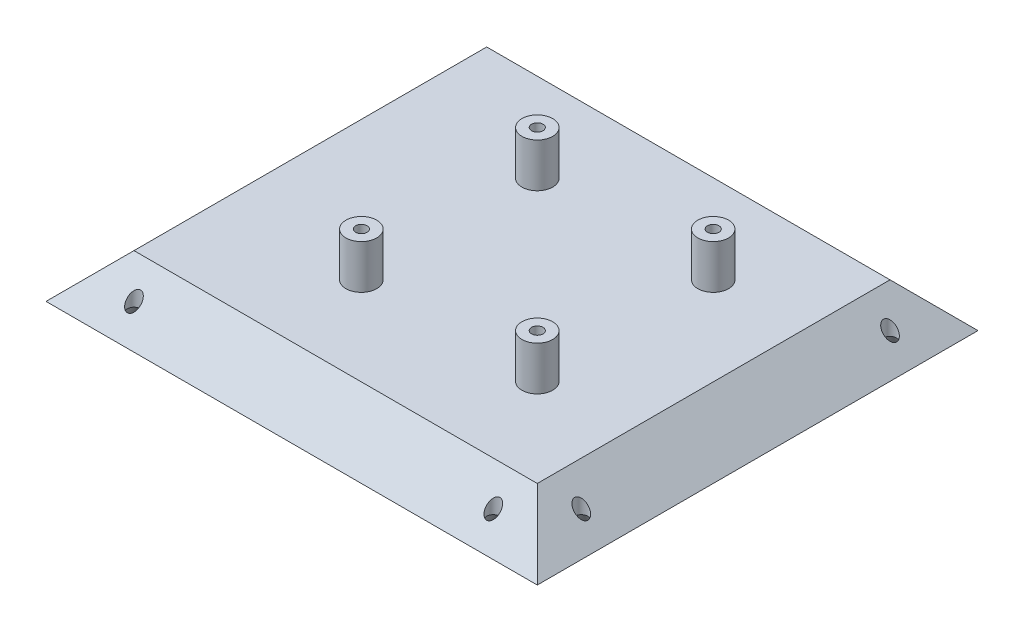
ISO-10303-21;
HEADER;
FILE_DESCRIPTION(('STEP AP214'),'2;1');
FILE_NAME('part.step','',(''),(''),'','','');
FILE_SCHEMA(('AUTOMOTIVE_DESIGN { 1 0 10303 214 1 1 1 1 }'));
ENDSEC;
DATA;
#1=APPLICATION_CONTEXT('core data for automotive mechanical design processes');
#2=APPLICATION_PROTOCOL_DEFINITION('international standard','automotive_design',2000,#1);
#3=PRODUCT_CONTEXT('',#1,'mechanical');
#4=PRODUCT('Part','Part','',(#3));
#5=PRODUCT_RELATED_PRODUCT_CATEGORY('part','',(#4));
#6=PRODUCT_DEFINITION_FORMATION('','',#4);
#7=PRODUCT_DEFINITION_CONTEXT('part definition',#1,'design');
#8=PRODUCT_DEFINITION('design','',#6,#7);
#9=PRODUCT_DEFINITION_SHAPE('','',#8);
#10=(LENGTH_UNIT() NAMED_UNIT(*) SI_UNIT(.MILLI.,.METRE.));
#11=(NAMED_UNIT(*) PLANE_ANGLE_UNIT() SI_UNIT($,.RADIAN.));
#12=(NAMED_UNIT(*) SI_UNIT($,.STERADIAN.) SOLID_ANGLE_UNIT());
#13=UNCERTAINTY_MEASURE_WITH_UNIT(LENGTH_MEASURE(1.E-05),#10,'distance_accuracy_value','');
#14=(GEOMETRIC_REPRESENTATION_CONTEXT(3) GLOBAL_UNCERTAINTY_ASSIGNED_CONTEXT((#13)) GLOBAL_UNIT_ASSIGNED_CONTEXT((#10,
#11,#12)) REPRESENTATION_CONTEXT('',''));
#15=CARTESIAN_POINT('',(0.,0.,0.));
#16=DIRECTION('',(0.,0.,1.));
#17=DIRECTION('',(1.,0.,0.));
#18=AXIS2_PLACEMENT_3D('',#15,#16,#17);
#19=CARTESIAN_POINT('',(0.,10.,0.));
#20=DIRECTION('',(0.,1.,0.));
#21=DIRECTION('',(0.,0.,1.));
#22=AXIS2_PLACEMENT_3D('',#19,#20,#21);
#23=PLANE('',#22);
#24=CARTESIAN_POINT('',(41.6,10.,30.1));
#25=DIRECTION('',(0.,1.,0.));
#26=DIRECTION('',(0.,0.,1.));
#27=AXIS2_PLACEMENT_3D('',#24,#25,#26);
#28=CIRCLE('',#27,3.5);
#29=CARTESIAN_POINT('',(41.6,10.,33.6));
#30=VERTEX_POINT('',#29);
#31=EDGE_CURVE('E367',#30,#30,#28,.T.);
#32=ORIENTED_EDGE('',*,*,#31,.F.);
#33=EDGE_LOOP('',(#32));
#34=FACE_BOUND('',#33,.T.);
#35=CARTESIAN_POINT('',(41.6,10.,70.1));
#36=DIRECTION('',(0.,1.,0.));
#37=DIRECTION('',(0.,0.,-1.));
#38=AXIS2_PLACEMENT_3D('',#35,#36,#37);
#39=CIRCLE('',#38,3.5);
#40=CARTESIAN_POINT('',(41.6,10.,66.6));
#41=VERTEX_POINT('',#40);
#42=EDGE_CURVE('E376',#41,#41,#39,.T.);
#43=ORIENTED_EDGE('',*,*,#42,.F.);
#44=EDGE_LOOP('',(#43));
#45=FACE_BOUND('',#44,.T.);
#46=CARTESIAN_POINT('',(81.6,10.,30.1));
#47=DIRECTION('',(0.,1.,0.));
#48=DIRECTION('',(0.,0.,-1.));
#49=AXIS2_PLACEMENT_3D('',#46,#47,#48);
#50=CIRCLE('',#49,3.50000000000001);
#51=CARTESIAN_POINT('',(81.6,10.,26.6));
#52=VERTEX_POINT('',#51);
#53=EDGE_CURVE('E385',#52,#52,#50,.T.);
#54=ORIENTED_EDGE('',*,*,#53,.F.);
#55=EDGE_LOOP('',(#54));
#56=FACE_BOUND('',#55,.T.);
#57=CARTESIAN_POINT('',(81.6,10.,70.1));
#58=DIRECTION('',(0.,1.,0.));
#59=DIRECTION('',(0.,0.,1.));
#60=AXIS2_PLACEMENT_3D('',#57,#58,#59);
#61=CIRCLE('',#60,3.50000000000001);
#62=CARTESIAN_POINT('',(81.6,10.,73.6));
#63=VERTEX_POINT('',#62);
#64=EDGE_CURVE('E394',#63,#63,#61,.T.);
#65=ORIENTED_EDGE('',*,*,#64,.F.);
#66=EDGE_LOOP('',(#65));
#67=FACE_BOUND('',#66,.T.);
#68=DIRECTION('',(-1.,0.,0.));
#69=VECTOR('',#68,1.);
#70=CARTESIAN_POINT('',(101.7,10.,10.));
#71=LINE('',#70,#69);
#72=CARTESIAN_POINT('',(101.7,10.,10.));
#73=VERTEX_POINT('',#72);
#74=CARTESIAN_POINT('',(9.99999999999999,10.,10.));
#75=VERTEX_POINT('',#74);
#76=EDGE_CURVE('E121',#73,#75,#71,.T.);
#77=ORIENTED_EDGE('',*,*,#76,.T.);
#78=DIRECTION('',(0.,0.,1.));
#79=VECTOR('',#78,1.);
#80=CARTESIAN_POINT('',(10.,10.,10.));
#81=LINE('',#80,#79);
#82=CARTESIAN_POINT('',(10.,10.,90.2));
#83=VERTEX_POINT('',#82);
#84=EDGE_CURVE('E118',#75,#83,#81,.T.);
#85=ORIENTED_EDGE('',*,*,#84,.T.);
#86=DIRECTION('',(1.,0.,0.));
#87=VECTOR('',#86,1.);
#88=CARTESIAN_POINT('',(10.,10.,90.2));
#89=LINE('',#88,#87);
#90=CARTESIAN_POINT('',(101.7,10.,90.2));
#91=VERTEX_POINT('',#90);
#92=EDGE_CURVE('E509',#83,#91,#89,.T.);
#93=ORIENTED_EDGE('',*,*,#92,.T.);
#94=DIRECTION('',(0.,0.,-1.));
#95=VECTOR('',#94,1.);
#96=CARTESIAN_POINT('',(101.7,10.,90.2));
#97=LINE('',#96,#95);
#98=EDGE_CURVE('E80',#91,#73,#97,.T.);
#99=ORIENTED_EDGE('',*,*,#98,.T.);
#100=EDGE_LOOP('',(#77,#85,#93,#99));
#101=FACE_BOUND('',#100,.T.);
#102=ADVANCED_FACE('F61',(#34,#45,#56,#67,#101),#23,.T.);
#103=CARTESIAN_POINT('',(0.,0.,0.));
#104=DIRECTION('',(0.,1.,0.));
#105=DIRECTION('',(0.,0.,1.));
#106=AXIS2_PLACEMENT_3D('',#103,#104,#105);
#107=PLANE('',#106);
#108=CARTESIAN_POINT('',(15.,0.,4.99999999999999));
#109=DIRECTION('',(0.,1.,0.));
#110=DIRECTION('',(1.,0.,0.));
#111=AXIS2_PLACEMENT_3D('',#108,#109,#110);
#112=CIRCLE('',#111,3.3);
#113=CARTESIAN_POINT('',(18.3,0.,4.99999999999999));
#114=VERTEX_POINT('',#113);
#115=EDGE_CURVE('E737',#114,#114,#112,.T.);
#116=ORIENTED_EDGE('',*,*,#115,.T.);
#117=EDGE_LOOP('',(#116));
#118=FACE_BOUND('',#117,.T.);
#119=CARTESIAN_POINT('',(4.99999999999999,0.,15.));
#120=DIRECTION('',(0.,-1.,0.));
#121=DIRECTION('',(0.,0.,1.));
#122=AXIS2_PLACEMENT_3D('',#119,#120,#121);
#123=CIRCLE('',#122,3.3);
#124=CARTESIAN_POINT('',(4.99999999999999,0.,18.3));
#125=VERTEX_POINT('',#124);
#126=EDGE_CURVE('E708',#125,#125,#123,.T.);
#127=ORIENTED_EDGE('',*,*,#126,.F.);
#128=EDGE_LOOP('',(#127));
#129=FACE_BOUND('',#128,.T.);
#130=CARTESIAN_POINT('',(15.0000000000001,0.,95.2));
#131=DIRECTION('',(0.,-1.,0.));
#132=DIRECTION('',(1.,0.,0.));
#133=AXIS2_PLACEMENT_3D('',#130,#131,#132);
#134=CIRCLE('',#133,3.3);
#135=CARTESIAN_POINT('',(18.3000000000001,0.,95.2));
#136=VERTEX_POINT('',#135);
#137=EDGE_CURVE('E670',#136,#136,#134,.T.);
#138=ORIENTED_EDGE('',*,*,#137,.F.);
#139=EDGE_LOOP('',(#138));
#140=FACE_BOUND('',#139,.T.);
#141=CARTESIAN_POINT('',(5.00000000000002,0.,85.2));
#142=DIRECTION('',(0.,1.,0.));
#143=DIRECTION('',(0.,0.,-1.));
#144=AXIS2_PLACEMENT_3D('',#141,#142,#143);
#145=CIRCLE('',#144,3.3);
#146=CARTESIAN_POINT('',(5.00000000000002,0.,81.9));
#147=VERTEX_POINT('',#146);
#148=EDGE_CURVE('E591',#147,#147,#145,.T.);
#149=ORIENTED_EDGE('',*,*,#148,.T.);
#150=EDGE_LOOP('',(#149));
#151=FACE_BOUND('',#150,.T.);
#152=CARTESIAN_POINT('',(96.7,0.,4.99999999999999));
#153=DIRECTION('',(0.,-1.,0.));
#154=DIRECTION('',(-1.,0.,0.));
#155=AXIS2_PLACEMENT_3D('',#152,#153,#154);
#156=CIRCLE('',#155,3.3);
#157=CARTESIAN_POINT('',(93.4,0.,4.99999999999999));
#158=VERTEX_POINT('',#157);
#159=EDGE_CURVE('E279',#158,#158,#156,.T.);
#160=ORIENTED_EDGE('',*,*,#159,.F.);
#161=EDGE_LOOP('',(#160));
#162=FACE_BOUND('',#161,.T.);
#163=CARTESIAN_POINT('',(106.7,0.,15.));
#164=DIRECTION('',(0.,1.,0.));
#165=DIRECTION('',(0.,0.,1.));
#166=AXIS2_PLACEMENT_3D('',#163,#164,#165);
#167=CIRCLE('',#166,3.3);
#168=CARTESIAN_POINT('',(106.7,0.,18.3));
#169=VERTEX_POINT('',#168);
#170=EDGE_CURVE('E268',#169,#169,#167,.T.);
#171=ORIENTED_EDGE('',*,*,#170,.T.);
#172=EDGE_LOOP('',(#171));
#173=FACE_BOUND('',#172,.T.);
#174=CARTESIAN_POINT('',(96.7,0.,95.2));
#175=DIRECTION('',(0.,1.,0.));
#176=DIRECTION('',(-1.,0.,0.));
#177=AXIS2_PLACEMENT_3D('',#174,#175,#176);
#178=CIRCLE('',#177,3.3);
#179=CARTESIAN_POINT('',(93.4,0.,95.2));
#180=VERTEX_POINT('',#179);
#181=EDGE_CURVE('E276',#180,#180,#178,.T.);
#182=ORIENTED_EDGE('',*,*,#181,.T.);
#183=EDGE_LOOP('',(#182));
#184=FACE_BOUND('',#183,.T.);
#185=CARTESIAN_POINT('',(106.7,0.,85.2));
#186=DIRECTION('',(0.,-1.,0.));
#187=DIRECTION('',(0.,0.,-1.));
#188=AXIS2_PLACEMENT_3D('',#185,#186,#187);
#189=CIRCLE('',#188,3.3);
#190=CARTESIAN_POINT('',(106.7,0.,81.9));
#191=VERTEX_POINT('',#190);
#192=EDGE_CURVE('E330',#191,#191,#189,.T.);
#193=ORIENTED_EDGE('',*,*,#192,.F.);
#194=EDGE_LOOP('',(#193));
#195=FACE_BOUND('',#194,.T.);
#196=DIRECTION('',(0.,0.,1.));
#197=VECTOR('',#196,1.);
#198=CARTESIAN_POINT('',(0.,0.,0.));
#199=LINE('',#198,#197);
#200=CARTESIAN_POINT('',(0.,0.,0.));
#201=VERTEX_POINT('',#200);
#202=CARTESIAN_POINT('',(0.,0.,100.2));
#203=VERTEX_POINT('',#202);
#204=EDGE_CURVE('E114',#201,#203,#199,.T.);
#205=ORIENTED_EDGE('',*,*,#204,.F.);
#206=DIRECTION('',(-1.,0.,0.));
#207=VECTOR('',#206,1.);
#208=CARTESIAN_POINT('',(0.,0.,0.));
#209=LINE('',#208,#207);
#210=CARTESIAN_POINT('',(111.7,0.,0.));
#211=VERTEX_POINT('',#210);
#212=EDGE_CURVE('E125',#211,#201,#209,.T.);
#213=ORIENTED_EDGE('',*,*,#212,.F.);
#214=DIRECTION('',(0.,0.,-1.));
#215=VECTOR('',#214,1.);
#216=CARTESIAN_POINT('',(111.7,0.,0.));
#217=LINE('',#216,#215);
#218=CARTESIAN_POINT('',(111.7,0.,100.2));
#219=VERTEX_POINT('',#218);
#220=EDGE_CURVE('E132',#219,#211,#217,.T.);
#221=ORIENTED_EDGE('',*,*,#220,.F.);
#222=DIRECTION('',(1.,0.,0.));
#223=VECTOR('',#222,1.);
#224=CARTESIAN_POINT('',(0.,0.,100.2));
#225=LINE('',#224,#223);
#226=EDGE_CURVE('E138',#203,#219,#225,.T.);
#227=ORIENTED_EDGE('',*,*,#226,.F.);
#228=EDGE_LOOP('',(#205,#213,#221,#227));
#229=FACE_BOUND('',#228,.T.);
#230=ADVANCED_FACE('F137',(#118,#129,#140,#151,#162,#173,#184,#195,#229),#107,.F.);
#231=CARTESIAN_POINT('',(0.,50.1,50.1));
#232=DIRECTION('',(0.,-0.707106781186547,-0.707106781186548));
#233=DIRECTION('',(0.,0.707106781186548,-0.707106781186547));
#234=AXIS2_PLACEMENT_3D('',#231,#232,#233);
#235=PLANE('',#234);
#236=CARTESIAN_POINT('',(15.,5.,95.2));
#237=DIRECTION('',(0.,-0.707106781186547,-0.707106781186548));
#238=DIRECTION('',(0.,-0.707106781186548,0.707106781186547));
#239=AXIS2_PLACEMENT_3D('',#236,#237,#238);
#240=ELLIPSE('',#239,2.12132034355964,1.5);
#241=CARTESIAN_POINT('',(15.,3.5,96.7));
#242=VERTEX_POINT('',#241);
#243=EDGE_CURVE('E140',#242,#242,#240,.T.);
#244=ORIENTED_EDGE('',*,*,#243,.T.);
#245=EDGE_LOOP('',(#244));
#246=FACE_BOUND('',#245,.T.);
#247=CARTESIAN_POINT('',(96.7,5.,95.2));
#248=DIRECTION('',(0.,-0.707106781186547,-0.707106781186548));
#249=DIRECTION('',(0.,-0.707106781186548,0.707106781186547));
#250=AXIS2_PLACEMENT_3D('',#247,#248,#249);
#251=ELLIPSE('',#250,2.12132034355964,1.5);
#252=CARTESIAN_POINT('',(96.7,3.5,96.7));
#253=VERTEX_POINT('',#252);
#254=EDGE_CURVE('E440',#253,#253,#251,.T.);
#255=ORIENTED_EDGE('',*,*,#254,.T.);
#256=EDGE_LOOP('',(#255));
#257=FACE_BOUND('',#256,.T.);
#258=DIRECTION('',(-0.577350269189626,0.577350269189626,-0.577350269189626));
#259=VECTOR('',#258,1.);
#260=CARTESIAN_POINT('',(111.7,0.,100.2));
#261=LINE('',#260,#259);
#262=EDGE_CURVE('E89',#219,#91,#261,.T.);
#263=ORIENTED_EDGE('',*,*,#262,.T.);
#264=ORIENTED_EDGE('',*,*,#92,.F.);
#265=DIRECTION('',(0.577350269189626,0.577350269189626,-0.577350269189626));
#266=VECTOR('',#265,1.);
#267=CARTESIAN_POINT('',(0.,0.,100.2));
#268=LINE('',#267,#266);
#269=EDGE_CURVE('E475',#203,#83,#268,.T.);
#270=ORIENTED_EDGE('',*,*,#269,.F.);
#271=ORIENTED_EDGE('',*,*,#226,.T.);
#272=EDGE_LOOP('',(#263,#264,#270,#271));
#273=FACE_BOUND('',#272,.T.);
#274=ADVANCED_FACE('F160',(#246,#257,#273),#235,.F.);
#275=CARTESIAN_POINT('',(0.,0.,0.));
#276=DIRECTION('',(0.707106781186548,-0.707106781186547,0.));
#277=DIRECTION('',(0.707106781186547,0.707106781186548,0.));
#278=AXIS2_PLACEMENT_3D('',#275,#276,#277);
#279=PLANE('',#278);
#280=CARTESIAN_POINT('',(5.,4.99999999999999,85.2));
#281=DIRECTION('',(0.707106781186548,-0.707106781186547,0.));
#282=DIRECTION('',(-0.707106781186547,-0.707106781186548,0.));
#283=AXIS2_PLACEMENT_3D('',#280,#281,#282);
#284=ELLIPSE('',#283,2.12132034355964,1.5);
#285=CARTESIAN_POINT('',(3.5,3.49999999999999,85.2));
#286=VERTEX_POINT('',#285);
#287=EDGE_CURVE('E437',#286,#286,#284,.T.);
#288=ORIENTED_EDGE('',*,*,#287,.T.);
#289=EDGE_LOOP('',(#288));
#290=FACE_BOUND('',#289,.T.);
#291=CARTESIAN_POINT('',(5.,4.99999999999999,15.));
#292=DIRECTION('',(0.707106781186548,-0.707106781186547,0.));
#293=DIRECTION('',(-0.707106781186547,-0.707106781186548,0.));
#294=AXIS2_PLACEMENT_3D('',#291,#292,#293);
#295=ELLIPSE('',#294,2.12132034355964,1.5);
#296=CARTESIAN_POINT('',(3.5,3.49999999999999,15.));
#297=VERTEX_POINT('',#296);
#298=EDGE_CURVE('E434',#297,#297,#295,.T.);
#299=ORIENTED_EDGE('',*,*,#298,.T.);
#300=EDGE_LOOP('',(#299));
#301=FACE_BOUND('',#300,.T.);
#302=ORIENTED_EDGE('',*,*,#269,.T.);
#303=ORIENTED_EDGE('',*,*,#84,.F.);
#304=DIRECTION('',(0.577350269189626,0.577350269189626,0.577350269189626));
#305=VECTOR('',#304,1.);
#306=CARTESIAN_POINT('',(0.,0.,0.));
#307=LINE('',#306,#305);
#308=EDGE_CURVE('E109',#201,#75,#307,.T.);
#309=ORIENTED_EDGE('',*,*,#308,.F.);
#310=ORIENTED_EDGE('',*,*,#204,.T.);
#311=EDGE_LOOP('',(#302,#303,#309,#310));
#312=FACE_BOUND('',#311,.T.);
#313=ADVANCED_FACE('F112',(#290,#301,#312),#279,.F.);
#314=CARTESIAN_POINT('',(55.8500000000001,55.85,0.));
#315=DIRECTION('',(-0.707106781186548,-0.707106781186547,0.));
#316=DIRECTION('',(0.707106781186547,-0.707106781186548,0.));
#317=AXIS2_PLACEMENT_3D('',#314,#315,#316);
#318=PLANE('',#317);
#319=CARTESIAN_POINT('',(106.7,5.00000000000004,85.2));
#320=DIRECTION('',(-0.707106781186548,-0.707106781186547,0.));
#321=DIRECTION('',(0.707106781186547,-0.707106781186548,0.));
#322=AXIS2_PLACEMENT_3D('',#319,#320,#321);
#323=ELLIPSE('',#322,2.12132034355964,1.5);
#324=CARTESIAN_POINT('',(108.2,3.50000000000004,85.2));
#325=VERTEX_POINT('',#324);
#326=EDGE_CURVE('E431',#325,#325,#323,.T.);
#327=ORIENTED_EDGE('',*,*,#326,.T.);
#328=EDGE_LOOP('',(#327));
#329=FACE_BOUND('',#328,.T.);
#330=CARTESIAN_POINT('',(106.7,5.00000000000004,15.));
#331=DIRECTION('',(-0.707106781186548,-0.707106781186547,0.));
#332=DIRECTION('',(0.707106781186547,-0.707106781186548,0.));
#333=AXIS2_PLACEMENT_3D('',#330,#331,#332);
#334=ELLIPSE('',#333,2.12132034355964,1.5);
#335=CARTESIAN_POINT('',(108.2,3.50000000000004,15.));
#336=VERTEX_POINT('',#335);
#337=EDGE_CURVE('E428',#336,#336,#334,.T.);
#338=ORIENTED_EDGE('',*,*,#337,.T.);
#339=EDGE_LOOP('',(#338));
#340=FACE_BOUND('',#339,.T.);
#341=DIRECTION('',(-0.577350269189626,0.577350269189626,0.577350269189626));
#342=VECTOR('',#341,1.);
#343=CARTESIAN_POINT('',(111.7,0.,0.));
#344=LINE('',#343,#342);
#345=EDGE_CURVE('E122',#211,#73,#344,.T.);
#346=ORIENTED_EDGE('',*,*,#345,.T.);
#347=ORIENTED_EDGE('',*,*,#98,.F.);
#348=ORIENTED_EDGE('',*,*,#262,.F.);
#349=ORIENTED_EDGE('',*,*,#220,.T.);
#350=EDGE_LOOP('',(#346,#347,#348,#349));
#351=FACE_BOUND('',#350,.T.);
#352=ADVANCED_FACE('F467',(#329,#340,#351),#318,.F.);
#353=CARTESIAN_POINT('',(0.,0.,0.));
#354=DIRECTION('',(0.,-0.707106781186547,0.707106781186547));
#355=DIRECTION('',(0.,-0.707106781186548,-0.707106781186548));
#356=AXIS2_PLACEMENT_3D('',#353,#354,#355);
#357=PLANE('',#356);
#358=CARTESIAN_POINT('',(15.,5.,5.));
#359=DIRECTION('',(0.,-0.707106781186547,0.707106781186547));
#360=DIRECTION('',(0.,-0.707106781186548,-0.707106781186548));
#361=AXIS2_PLACEMENT_3D('',#358,#359,#360);
#362=ELLIPSE('',#361,2.12132034355964,1.5);
#363=CARTESIAN_POINT('',(15.,3.5,3.5));
#364=VERTEX_POINT('',#363);
#365=EDGE_CURVE('E425',#364,#364,#362,.T.);
#366=ORIENTED_EDGE('',*,*,#365,.T.);
#367=EDGE_LOOP('',(#366));
#368=FACE_BOUND('',#367,.T.);
#369=CARTESIAN_POINT('',(96.7,5.,5.));
#370=DIRECTION('',(0.,-0.707106781186547,0.707106781186547));
#371=DIRECTION('',(0.,-0.707106781186548,-0.707106781186548));
#372=AXIS2_PLACEMENT_3D('',#369,#370,#371);
#373=ELLIPSE('',#372,2.12132034355964,1.5);
#374=CARTESIAN_POINT('',(96.7,3.5,3.5));
#375=VERTEX_POINT('',#374);
#376=EDGE_CURVE('E397',#375,#375,#373,.T.);
#377=ORIENTED_EDGE('',*,*,#376,.T.);
#378=EDGE_LOOP('',(#377));
#379=FACE_BOUND('',#378,.T.);
#380=ORIENTED_EDGE('',*,*,#308,.T.);
#381=ORIENTED_EDGE('',*,*,#76,.F.);
#382=ORIENTED_EDGE('',*,*,#345,.F.);
#383=ORIENTED_EDGE('',*,*,#212,.T.);
#384=EDGE_LOOP('',(#380,#381,#382,#383));
#385=FACE_BOUND('',#384,.T.);
#386=ADVANCED_FACE('F127',(#368,#379,#385),#357,.F.);
#387=CARTESIAN_POINT('',(96.7,10.0001,5.));
#388=DIRECTION('',(0.,-1.,0.));
#389=DIRECTION('',(0.,0.,-1.));
#390=AXIS2_PLACEMENT_3D('',#387,#388,#389);
#391=CYLINDRICAL_SURFACE('',#390,1.5);
#392=CARTESIAN_POINT('',(96.7,2.8,4.99999999999999));
#393=DIRECTION('',(0.,-1.,0.));
#394=DIRECTION('',(-1.,0.,0.));
#395=AXIS2_PLACEMENT_3D('',#392,#393,#394);
#396=CIRCLE('',#395,1.5);
#397=CARTESIAN_POINT('',(95.2,2.8,4.99999999999999));
#398=VERTEX_POINT('',#397);
#399=EDGE_CURVE('E273',#398,#398,#396,.T.);
#400=ORIENTED_EDGE('',*,*,#399,.T.);
#401=EDGE_LOOP('',(#400));
#402=FACE_BOUND('',#401,.T.);
#403=ORIENTED_EDGE('',*,*,#376,.F.);
#404=EDGE_LOOP('',(#403));
#405=FACE_BOUND('',#404,.T.);
#406=ADVANCED_FACE('F248',(#402,#405),#391,.F.);
#407=CARTESIAN_POINT('',(15.,10.0001,5.));
#408=DIRECTION('',(0.,-1.,0.));
#409=DIRECTION('',(0.,0.,-1.));
#410=AXIS2_PLACEMENT_3D('',#407,#408,#409);
#411=CYLINDRICAL_SURFACE('',#410,1.5);
#412=CARTESIAN_POINT('',(15.,2.8,4.99999999999999));
#413=DIRECTION('',(0.,1.,0.));
#414=DIRECTION('',(1.,0.,0.));
#415=AXIS2_PLACEMENT_3D('',#412,#413,#414);
#416=CIRCLE('',#415,1.5);
#417=CARTESIAN_POINT('',(16.5,2.8,4.99999999999999));
#418=VERTEX_POINT('',#417);
#419=EDGE_CURVE('E234',#418,#418,#416,.T.);
#420=ORIENTED_EDGE('',*,*,#419,.F.);
#421=EDGE_LOOP('',(#420));
#422=FACE_BOUND('',#421,.T.);
#423=ORIENTED_EDGE('',*,*,#365,.F.);
#424=EDGE_LOOP('',(#423));
#425=FACE_BOUND('',#424,.T.);
#426=ADVANCED_FACE('F238',(#422,#425),#411,.F.);
#427=CARTESIAN_POINT('',(106.7,10.0001,15.));
#428=DIRECTION('',(0.,-1.,0.));
#429=DIRECTION('',(0.,0.,-1.));
#430=AXIS2_PLACEMENT_3D('',#427,#428,#429);
#431=CYLINDRICAL_SURFACE('',#430,1.5);
#432=CARTESIAN_POINT('',(106.7,2.8,15.));
#433=DIRECTION('',(0.,1.,0.));
#434=DIRECTION('',(0.,0.,1.));
#435=AXIS2_PLACEMENT_3D('',#432,#433,#434);
#436=CIRCLE('',#435,1.5);
#437=CARTESIAN_POINT('',(106.7,2.8,16.5));
#438=VERTEX_POINT('',#437);
#439=EDGE_CURVE('E272',#438,#438,#436,.T.);
#440=ORIENTED_EDGE('',*,*,#439,.F.);
#441=EDGE_LOOP('',(#440));
#442=FACE_BOUND('',#441,.T.);
#443=ORIENTED_EDGE('',*,*,#337,.F.);
#444=EDGE_LOOP('',(#443));
#445=FACE_BOUND('',#444,.T.);
#446=ADVANCED_FACE('F247',(#442,#445),#431,.F.);
#447=CARTESIAN_POINT('',(106.7,10.0001,85.2));
#448=DIRECTION('',(0.,-1.,0.));
#449=DIRECTION('',(0.,0.,-1.));
#450=AXIS2_PLACEMENT_3D('',#447,#448,#449);
#451=CYLINDRICAL_SURFACE('',#450,1.5);
#452=CARTESIAN_POINT('',(106.7,2.8,85.2));
#453=DIRECTION('',(0.,-1.,0.));
#454=DIRECTION('',(0.,0.,-1.));
#455=AXIS2_PLACEMENT_3D('',#452,#453,#454);
#456=CIRCLE('',#455,1.5);
#457=CARTESIAN_POINT('',(106.7,2.8,83.7));
#458=VERTEX_POINT('',#457);
#459=EDGE_CURVE('E349',#458,#458,#456,.T.);
#460=ORIENTED_EDGE('',*,*,#459,.T.);
#461=EDGE_LOOP('',(#460));
#462=FACE_BOUND('',#461,.T.);
#463=ORIENTED_EDGE('',*,*,#326,.F.);
#464=EDGE_LOOP('',(#463));
#465=FACE_BOUND('',#464,.T.);
#466=ADVANCED_FACE('F252',(#462,#465),#451,.F.);
#467=CARTESIAN_POINT('',(5.,10.0001,15.));
#468=DIRECTION('',(0.,-1.,0.));
#469=DIRECTION('',(0.,0.,-1.));
#470=AXIS2_PLACEMENT_3D('',#467,#468,#469);
#471=CYLINDRICAL_SURFACE('',#470,1.5);
#472=CARTESIAN_POINT('',(4.99999999999999,2.8,15.));
#473=DIRECTION('',(0.,-1.,0.));
#474=DIRECTION('',(0.,0.,1.));
#475=AXIS2_PLACEMENT_3D('',#472,#473,#474);
#476=CIRCLE('',#475,1.5);
#477=CARTESIAN_POINT('',(4.99999999999999,2.8,16.5));
#478=VERTEX_POINT('',#477);
#479=EDGE_CURVE('E675',#478,#478,#476,.T.);
#480=ORIENTED_EDGE('',*,*,#479,.T.);
#481=EDGE_LOOP('',(#480));
#482=FACE_BOUND('',#481,.T.);
#483=ORIENTED_EDGE('',*,*,#298,.F.);
#484=EDGE_LOOP('',(#483));
#485=FACE_BOUND('',#484,.T.);
#486=ADVANCED_FACE('F162',(#482,#485),#471,.F.);
#487=CARTESIAN_POINT('',(5.,10.0001,85.2));
#488=DIRECTION('',(0.,-1.,0.));
#489=DIRECTION('',(0.,0.,-1.));
#490=AXIS2_PLACEMENT_3D('',#487,#488,#489);
#491=CYLINDRICAL_SURFACE('',#490,1.5);
#492=CARTESIAN_POINT('',(5.00000000000002,2.8,85.2));
#493=DIRECTION('',(0.,1.,0.));
#494=DIRECTION('',(0.,0.,-1.));
#495=AXIS2_PLACEMENT_3D('',#492,#493,#494);
#496=CIRCLE('',#495,1.5);
#497=CARTESIAN_POINT('',(5.00000000000002,2.8,83.7));
#498=VERTEX_POINT('',#497);
#499=EDGE_CURVE('E588',#498,#498,#496,.T.);
#500=ORIENTED_EDGE('',*,*,#499,.F.);
#501=EDGE_LOOP('',(#500));
#502=FACE_BOUND('',#501,.T.);
#503=ORIENTED_EDGE('',*,*,#287,.F.);
#504=EDGE_LOOP('',(#503));
#505=FACE_BOUND('',#504,.T.);
#506=ADVANCED_FACE('F573',(#502,#505),#491,.F.);
#507=CARTESIAN_POINT('',(96.7,10.0001,95.2));
#508=DIRECTION('',(0.,-1.,0.));
#509=DIRECTION('',(0.,0.,-1.));
#510=AXIS2_PLACEMENT_3D('',#507,#508,#509);
#511=CYLINDRICAL_SURFACE('',#510,1.5);
#512=CARTESIAN_POINT('',(96.7,2.8,95.2));
#513=DIRECTION('',(0.,1.,0.));
#514=DIRECTION('',(-1.,0.,0.));
#515=AXIS2_PLACEMENT_3D('',#512,#513,#514);
#516=CIRCLE('',#515,1.5);
#517=CARTESIAN_POINT('',(95.2,2.8,95.2));
#518=VERTEX_POINT('',#517);
#519=EDGE_CURVE('E326',#518,#518,#516,.T.);
#520=ORIENTED_EDGE('',*,*,#519,.F.);
#521=EDGE_LOOP('',(#520));
#522=FACE_BOUND('',#521,.T.);
#523=ORIENTED_EDGE('',*,*,#254,.F.);
#524=EDGE_LOOP('',(#523));
#525=FACE_BOUND('',#524,.T.);
#526=ADVANCED_FACE('F570',(#522,#525),#511,.F.);
#527=CARTESIAN_POINT('',(15.,10.0001,95.2));
#528=DIRECTION('',(0.,-1.,0.));
#529=DIRECTION('',(0.,0.,-1.));
#530=AXIS2_PLACEMENT_3D('',#527,#528,#529);
#531=CYLINDRICAL_SURFACE('',#530,1.5);
#532=CARTESIAN_POINT('',(15.0000000000001,2.8,95.2));
#533=DIRECTION('',(0.,-1.,0.));
#534=DIRECTION('',(1.,0.,0.));
#535=AXIS2_PLACEMENT_3D('',#532,#533,#534);
#536=CIRCLE('',#535,1.5);
#537=CARTESIAN_POINT('',(16.5000000000001,2.8,95.2));
#538=VERTEX_POINT('',#537);
#539=EDGE_CURVE('E644',#538,#538,#536,.T.);
#540=ORIENTED_EDGE('',*,*,#539,.T.);
#541=EDGE_LOOP('',(#540));
#542=FACE_BOUND('',#541,.T.);
#543=ORIENTED_EDGE('',*,*,#243,.F.);
#544=EDGE_LOOP('',(#543));
#545=FACE_BOUND('',#544,.T.);
#546=ADVANCED_FACE('F808',(#542,#545),#531,.F.);
#547=CARTESIAN_POINT('',(81.6,20.,70.1));
#548=DIRECTION('',(0.,1.,0.));
#549=DIRECTION('',(0.,0.,1.));
#550=AXIS2_PLACEMENT_3D('',#547,#548,#549);
#551=PLANE('',#550);
#552=CARTESIAN_POINT('',(81.6,20.,70.1));
#553=DIRECTION('',(0.,1.,0.));
#554=DIRECTION('',(0.,0.,1.));
#555=AXIS2_PLACEMENT_3D('',#552,#553,#554);
#556=CIRCLE('',#555,3.50000000000001);
#557=CARTESIAN_POINT('',(81.6,20.,73.6));
#558=VERTEX_POINT('',#557);
#559=EDGE_CURVE('E395',#558,#558,#556,.T.);
#560=ORIENTED_EDGE('',*,*,#559,.T.);
#561=EDGE_LOOP('',(#560));
#562=FACE_BOUND('',#561,.T.);
#563=CARTESIAN_POINT('',(81.6,20.,70.1));
#564=DIRECTION('',(0.,1.,0.));
#565=DIRECTION('',(0.,0.,1.));
#566=AXIS2_PLACEMENT_3D('',#563,#564,#565);
#567=CIRCLE('',#566,1.29999999999999);
#568=CARTESIAN_POINT('',(81.6,20.,71.4));
#569=VERTEX_POINT('',#568);
#570=EDGE_CURVE('E389',#569,#569,#567,.T.);
#571=ORIENTED_EDGE('',*,*,#570,.F.);
#572=EDGE_LOOP('',(#571));
#573=FACE_BOUND('',#572,.T.);
#574=ADVANCED_FACE('F816',(#562,#573),#551,.T.);
#575=CARTESIAN_POINT('',(81.6,20.,70.1));
#576=DIRECTION('',(0.,-1.,0.));
#577=DIRECTION('',(0.,0.,-1.));
#578=AXIS2_PLACEMENT_3D('',#575,#576,#577);
#579=CYLINDRICAL_SURFACE('',#578,3.50000000000001);
#580=ORIENTED_EDGE('',*,*,#559,.F.);
#581=EDGE_LOOP('',(#580));
#582=FACE_BOUND('',#581,.T.);
#583=ORIENTED_EDGE('',*,*,#64,.T.);
#584=EDGE_LOOP('',(#583));
#585=FACE_BOUND('',#584,.T.);
#586=ADVANCED_FACE('F401',(#582,#585),#579,.T.);
#587=CARTESIAN_POINT('',(81.6,20.,70.1));
#588=DIRECTION('',(0.,-1.,0.));
#589=DIRECTION('',(0.,0.,-1.));
#590=AXIS2_PLACEMENT_3D('',#587,#588,#589);
#591=CYLINDRICAL_SURFACE('',#590,1.29999999999999);
#592=ORIENTED_EDGE('',*,*,#570,.T.);
#593=EDGE_LOOP('',(#592));
#594=FACE_BOUND('',#593,.T.);
#595=CARTESIAN_POINT('',(81.6,10.,70.1));
#596=DIRECTION('',(0.,1.,0.));
#597=DIRECTION('',(0.,0.,1.));
#598=AXIS2_PLACEMENT_3D('',#595,#596,#597);
#599=CIRCLE('',#598,1.29999999999999);
#600=CARTESIAN_POINT('',(81.6,10.,71.4));
#601=VERTEX_POINT('',#600);
#602=EDGE_CURVE('E445',#601,#601,#599,.F.);
#603=ORIENTED_EDGE('',*,*,#602,.T.);
#604=EDGE_LOOP('',(#603));
#605=FACE_BOUND('',#604,.T.);
#606=ADVANCED_FACE('F832',(#594,#605),#591,.F.);
#607=ORIENTED_EDGE('',*,*,#602,.F.);
#608=EDGE_LOOP('',(#607));
#609=FACE_BOUND('',#608,.T.);
#610=ADVANCED_FACE('F406',(#609),#23,.T.);
#611=CARTESIAN_POINT('',(81.6,20.,30.1));
#612=DIRECTION('',(0.,-1.,0.));
#613=DIRECTION('',(0.,0.,-1.));
#614=AXIS2_PLACEMENT_3D('',#611,#612,#613);
#615=PLANE('',#614);
#616=CARTESIAN_POINT('',(81.6,20.,30.1));
#617=DIRECTION('',(0.,1.,0.));
#618=DIRECTION('',(0.,0.,-1.));
#619=AXIS2_PLACEMENT_3D('',#616,#617,#618);
#620=CIRCLE('',#619,3.50000000000001);
#621=CARTESIAN_POINT('',(81.6,20.,26.6));
#622=VERTEX_POINT('',#621);
#623=EDGE_CURVE('E386',#622,#622,#620,.T.);
#624=ORIENTED_EDGE('',*,*,#623,.T.);
#625=EDGE_LOOP('',(#624));
#626=FACE_BOUND('',#625,.T.);
#627=CARTESIAN_POINT('',(81.6,20.,30.1));
#628=DIRECTION('',(0.,1.,0.));
#629=DIRECTION('',(0.,0.,-1.));
#630=AXIS2_PLACEMENT_3D('',#627,#628,#629);
#631=CIRCLE('',#630,1.29999999999999);
#632=CARTESIAN_POINT('',(81.6,20.,28.8));
#633=VERTEX_POINT('',#632);
#634=EDGE_CURVE('E380',#633,#633,#631,.T.);
#635=ORIENTED_EDGE('',*,*,#634,.F.);
#636=EDGE_LOOP('',(#635));
#637=FACE_BOUND('',#636,.T.);
#638=ADVANCED_FACE('F847',(#626,#637),#615,.F.);
#639=CARTESIAN_POINT('',(81.6,20.,30.1));
#640=DIRECTION('',(0.,-1.,0.));
#641=DIRECTION('',(0.,0.,-1.));
#642=AXIS2_PLACEMENT_3D('',#639,#640,#641);
#643=CYLINDRICAL_SURFACE('',#642,3.50000000000001);
#644=ORIENTED_EDGE('',*,*,#623,.F.);
#645=EDGE_LOOP('',(#644));
#646=FACE_BOUND('',#645,.T.);
#647=ORIENTED_EDGE('',*,*,#53,.T.);
#648=EDGE_LOOP('',(#647));
#649=FACE_BOUND('',#648,.T.);
#650=ADVANCED_FACE('F855',(#646,#649),#643,.T.);
#651=CARTESIAN_POINT('',(81.6,20.,30.1));
#652=DIRECTION('',(0.,-1.,0.));
#653=DIRECTION('',(0.,0.,-1.));
#654=AXIS2_PLACEMENT_3D('',#651,#652,#653);
#655=CYLINDRICAL_SURFACE('',#654,1.29999999999999);
#656=ORIENTED_EDGE('',*,*,#634,.T.);
#657=EDGE_LOOP('',(#656));
#658=FACE_BOUND('',#657,.T.);
#659=CARTESIAN_POINT('',(81.6,10.,30.1));
#660=DIRECTION('',(0.,1.,0.));
#661=DIRECTION('',(0.,0.,1.));
#662=AXIS2_PLACEMENT_3D('',#659,#660,#661);
#663=CIRCLE('',#662,1.29999999999999);
#664=CARTESIAN_POINT('',(81.6,10.,31.4));
#665=VERTEX_POINT('',#664);
#666=EDGE_CURVE('E448',#665,#665,#663,.F.);
#667=ORIENTED_EDGE('',*,*,#666,.T.);
#668=EDGE_LOOP('',(#667));
#669=FACE_BOUND('',#668,.T.);
#670=ADVANCED_FACE('F863',(#658,#669),#655,.F.);
#671=ORIENTED_EDGE('',*,*,#666,.F.);
#672=EDGE_LOOP('',(#671));
#673=FACE_BOUND('',#672,.T.);
#674=ADVANCED_FACE('F849',(#673),#23,.T.);
#675=CARTESIAN_POINT('',(41.6,20.,70.1));
#676=DIRECTION('',(0.,-1.,0.));
#677=DIRECTION('',(0.,0.,-1.));
#678=AXIS2_PLACEMENT_3D('',#675,#676,#677);
#679=PLANE('',#678);
#680=CARTESIAN_POINT('',(41.6,20.,70.1));
#681=DIRECTION('',(0.,1.,0.));
#682=DIRECTION('',(0.,0.,-1.));
#683=AXIS2_PLACEMENT_3D('',#680,#681,#682);
#684=CIRCLE('',#683,3.5);
#685=CARTESIAN_POINT('',(41.6,20.,66.6));
#686=VERTEX_POINT('',#685);
#687=EDGE_CURVE('E377',#686,#686,#684,.T.);
#688=ORIENTED_EDGE('',*,*,#687,.T.);
#689=EDGE_LOOP('',(#688));
#690=FACE_BOUND('',#689,.T.);
#691=CARTESIAN_POINT('',(41.6,20.,70.1));
#692=DIRECTION('',(0.,1.,0.));
#693=DIRECTION('',(0.,0.,-1.));
#694=AXIS2_PLACEMENT_3D('',#691,#692,#693);
#695=CIRCLE('',#694,1.3);
#696=CARTESIAN_POINT('',(41.6,20.,68.8));
#697=VERTEX_POINT('',#696);
#698=EDGE_CURVE('E371',#697,#697,#695,.T.);
#699=ORIENTED_EDGE('',*,*,#698,.F.);
#700=EDGE_LOOP('',(#699));
#701=FACE_BOUND('',#700,.T.);
#702=ADVANCED_FACE('F878',(#690,#701),#679,.F.);
#703=CARTESIAN_POINT('',(41.6,20.,70.1));
#704=DIRECTION('',(0.,-1.,0.));
#705=DIRECTION('',(0.,0.,-1.));
#706=AXIS2_PLACEMENT_3D('',#703,#704,#705);
#707=CYLINDRICAL_SURFACE('',#706,3.5);
#708=ORIENTED_EDGE('',*,*,#687,.F.);
#709=EDGE_LOOP('',(#708));
#710=FACE_BOUND('',#709,.T.);
#711=ORIENTED_EDGE('',*,*,#42,.T.);
#712=EDGE_LOOP('',(#711));
#713=FACE_BOUND('',#712,.T.);
#714=ADVANCED_FACE('F886',(#710,#713),#707,.T.);
#715=CARTESIAN_POINT('',(41.6,20.,70.1));
#716=DIRECTION('',(0.,-1.,0.));
#717=DIRECTION('',(0.,0.,-1.));
#718=AXIS2_PLACEMENT_3D('',#715,#716,#717);
#719=CYLINDRICAL_SURFACE('',#718,1.3);
#720=ORIENTED_EDGE('',*,*,#698,.T.);
#721=EDGE_LOOP('',(#720));
#722=FACE_BOUND('',#721,.T.);
#723=CARTESIAN_POINT('',(41.6,10.,70.1));
#724=DIRECTION('',(0.,1.,0.));
#725=DIRECTION('',(0.,0.,1.));
#726=AXIS2_PLACEMENT_3D('',#723,#724,#725);
#727=CIRCLE('',#726,1.3);
#728=CARTESIAN_POINT('',(41.6,10.,71.4));
#729=VERTEX_POINT('',#728);
#730=EDGE_CURVE('E72',#729,#729,#727,.F.);
#731=ORIENTED_EDGE('',*,*,#730,.T.);
#732=EDGE_LOOP('',(#731));
#733=FACE_BOUND('',#732,.T.);
#734=ADVANCED_FACE('F894',(#722,#733),#719,.F.);
#735=ORIENTED_EDGE('',*,*,#730,.F.);
#736=EDGE_LOOP('',(#735));
#737=FACE_BOUND('',#736,.T.);
#738=ADVANCED_FACE('F880',(#737),#23,.T.);
#739=CARTESIAN_POINT('',(41.6,20.,30.1));
#740=DIRECTION('',(0.,1.,0.));
#741=DIRECTION('',(0.,0.,1.));
#742=AXIS2_PLACEMENT_3D('',#739,#740,#741);
#743=PLANE('',#742);
#744=CARTESIAN_POINT('',(41.6,20.,30.1));
#745=DIRECTION('',(0.,1.,0.));
#746=DIRECTION('',(0.,0.,1.));
#747=AXIS2_PLACEMENT_3D('',#744,#745,#746);
#748=CIRCLE('',#747,3.5);
#749=CARTESIAN_POINT('',(41.6,20.,33.6));
#750=VERTEX_POINT('',#749);
#751=EDGE_CURVE('E368',#750,#750,#748,.T.);
#752=ORIENTED_EDGE('',*,*,#751,.T.);
#753=EDGE_LOOP('',(#752));
#754=FACE_BOUND('',#753,.T.);
#755=CARTESIAN_POINT('',(41.6,20.,30.1));
#756=DIRECTION('',(0.,1.,0.));
#757=DIRECTION('',(0.,0.,1.));
#758=AXIS2_PLACEMENT_3D('',#755,#756,#757);
#759=CIRCLE('',#758,1.3);
#760=CARTESIAN_POINT('',(41.6,20.,31.4));
#761=VERTEX_POINT('',#760);
#762=EDGE_CURVE('E362',#761,#761,#759,.T.);
#763=ORIENTED_EDGE('',*,*,#762,.F.);
#764=EDGE_LOOP('',(#763));
#765=FACE_BOUND('',#764,.T.);
#766=ADVANCED_FACE('F909',(#754,#765),#743,.T.);
#767=CARTESIAN_POINT('',(41.6,20.,30.1));
#768=DIRECTION('',(0.,-1.,0.));
#769=DIRECTION('',(0.,0.,-1.));
#770=AXIS2_PLACEMENT_3D('',#767,#768,#769);
#771=CYLINDRICAL_SURFACE('',#770,3.5);
#772=ORIENTED_EDGE('',*,*,#751,.F.);
#773=EDGE_LOOP('',(#772));
#774=FACE_BOUND('',#773,.T.);
#775=ORIENTED_EDGE('',*,*,#31,.T.);
#776=EDGE_LOOP('',(#775));
#777=FACE_BOUND('',#776,.T.);
#778=ADVANCED_FACE('F916',(#774,#777),#771,.T.);
#779=CARTESIAN_POINT('',(41.6,20.,30.1));
#780=DIRECTION('',(0.,-1.,0.));
#781=DIRECTION('',(0.,0.,-1.));
#782=AXIS2_PLACEMENT_3D('',#779,#780,#781);
#783=CYLINDRICAL_SURFACE('',#782,1.3);
#784=ORIENTED_EDGE('',*,*,#762,.T.);
#785=EDGE_LOOP('',(#784));
#786=FACE_BOUND('',#785,.T.);
#787=CARTESIAN_POINT('',(41.6,10.,30.1));
#788=DIRECTION('',(0.,1.,0.));
#789=DIRECTION('',(0.,0.,1.));
#790=AXIS2_PLACEMENT_3D('',#787,#788,#789);
#791=CIRCLE('',#790,1.3);
#792=CARTESIAN_POINT('',(41.6,10.,31.4));
#793=VERTEX_POINT('',#792);
#794=EDGE_CURVE('E12',#793,#793,#791,.F.);
#795=ORIENTED_EDGE('',*,*,#794,.T.);
#796=EDGE_LOOP('',(#795));
#797=FACE_BOUND('',#796,.T.);
#798=ADVANCED_FACE('F924',(#786,#797),#783,.F.);
#799=ORIENTED_EDGE('',*,*,#794,.F.);
#800=EDGE_LOOP('',(#799));
#801=FACE_BOUND('',#800,.T.);
#802=ADVANCED_FACE('F405',(#801),#23,.T.);
#803=CARTESIAN_POINT('',(106.7,2.8,85.2));
#804=DIRECTION('',(0.,-1.,0.));
#805=DIRECTION('',(0.,0.,-1.));
#806=AXIS2_PLACEMENT_3D('',#803,#804,#805);
#807=CONICAL_SURFACE('',#806,1.5,0.571337479833628);
#808=ORIENTED_EDGE('',*,*,#192,.T.);
#809=EDGE_LOOP('',(#808));
#810=FACE_BOUND('',#809,.T.);
#811=ORIENTED_EDGE('',*,*,#459,.F.);
#812=EDGE_LOOP('',(#811));
#813=FACE_BOUND('',#812,.T.);
#814=ADVANCED_FACE('F311',(#810,#813),#807,.F.);
#815=CARTESIAN_POINT('',(96.7,2.8,95.2));
#816=DIRECTION('',(0.,-1.,0.));
#817=DIRECTION('',(-1.,0.,0.));
#818=AXIS2_PLACEMENT_3D('',#815,#816,#817);
#819=CONICAL_SURFACE('',#818,1.5,0.571337479833628);
#820=ORIENTED_EDGE('',*,*,#181,.F.);
#821=EDGE_LOOP('',(#820));
#822=FACE_BOUND('',#821,.T.);
#823=ORIENTED_EDGE('',*,*,#519,.T.);
#824=EDGE_LOOP('',(#823));
#825=FACE_BOUND('',#824,.T.);
#826=ADVANCED_FACE('F301',(#822,#825),#819,.F.);
#827=CARTESIAN_POINT('',(106.7,2.8,15.));
#828=DIRECTION('',(0.,-1.,0.));
#829=DIRECTION('',(0.,0.,1.));
#830=AXIS2_PLACEMENT_3D('',#827,#828,#829);
#831=CONICAL_SURFACE('',#830,1.5,0.571337479833628);
#832=ORIENTED_EDGE('',*,*,#170,.F.);
#833=EDGE_LOOP('',(#832));
#834=FACE_BOUND('',#833,.T.);
#835=ORIENTED_EDGE('',*,*,#439,.T.);
#836=EDGE_LOOP('',(#835));
#837=FACE_BOUND('',#836,.T.);
#838=ADVANCED_FACE('F310',(#834,#837),#831,.F.);
#839=CARTESIAN_POINT('',(96.7,2.8,4.99999999999999));
#840=DIRECTION('',(0.,-1.,0.));
#841=DIRECTION('',(-1.,0.,0.));
#842=AXIS2_PLACEMENT_3D('',#839,#840,#841);
#843=CONICAL_SURFACE('',#842,1.5,0.571337479833628);
#844=ORIENTED_EDGE('',*,*,#159,.T.);
#845=EDGE_LOOP('',(#844));
#846=FACE_BOUND('',#845,.T.);
#847=ORIENTED_EDGE('',*,*,#399,.F.);
#848=EDGE_LOOP('',(#847));
#849=FACE_BOUND('',#848,.T.);
#850=ADVANCED_FACE('F612',(#846,#849),#843,.F.);
#851=CARTESIAN_POINT('',(5.00000000000002,2.8,85.2));
#852=DIRECTION('',(0.,-1.,0.));
#853=DIRECTION('',(0.,0.,-1.));
#854=AXIS2_PLACEMENT_3D('',#851,#852,#853);
#855=CONICAL_SURFACE('',#854,1.5,0.571337479833628);
#856=ORIENTED_EDGE('',*,*,#148,.F.);
#857=EDGE_LOOP('',(#856));
#858=FACE_BOUND('',#857,.T.);
#859=ORIENTED_EDGE('',*,*,#499,.T.);
#860=EDGE_LOOP('',(#859));
#861=FACE_BOUND('',#860,.T.);
#862=ADVANCED_FACE('F616',(#858,#861),#855,.F.);
#863=CARTESIAN_POINT('',(15.0000000000001,2.8,95.2));
#864=DIRECTION('',(0.,-1.,0.));
#865=DIRECTION('',(1.,0.,0.));
#866=AXIS2_PLACEMENT_3D('',#863,#864,#865);
#867=CONICAL_SURFACE('',#866,1.5,0.571337479833628);
#868=ORIENTED_EDGE('',*,*,#137,.T.);
#869=EDGE_LOOP('',(#868));
#870=FACE_BOUND('',#869,.T.);
#871=ORIENTED_EDGE('',*,*,#539,.F.);
#872=EDGE_LOOP('',(#871));
#873=FACE_BOUND('',#872,.T.);
#874=ADVANCED_FACE('F620',(#870,#873),#867,.F.);
#875=CARTESIAN_POINT('',(4.99999999999999,2.8,15.));
#876=DIRECTION('',(0.,-1.,0.));
#877=DIRECTION('',(0.,0.,1.));
#878=AXIS2_PLACEMENT_3D('',#875,#876,#877);
#879=CONICAL_SURFACE('',#878,1.5,0.571337479833628);
#880=ORIENTED_EDGE('',*,*,#126,.T.);
#881=EDGE_LOOP('',(#880));
#882=FACE_BOUND('',#881,.T.);
#883=ORIENTED_EDGE('',*,*,#479,.F.);
#884=EDGE_LOOP('',(#883));
#885=FACE_BOUND('',#884,.T.);
#886=ADVANCED_FACE('F689',(#882,#885),#879,.F.);
#887=CARTESIAN_POINT('',(15.,2.8,4.99999999999999));
#888=DIRECTION('',(0.,-1.,0.));
#889=DIRECTION('',(1.,0.,0.));
#890=AXIS2_PLACEMENT_3D('',#887,#888,#889);
#891=CONICAL_SURFACE('',#890,1.5,0.571337479833628);
#892=ORIENTED_EDGE('',*,*,#115,.F.);
#893=EDGE_LOOP('',(#892));
#894=FACE_BOUND('',#893,.T.);
#895=ORIENTED_EDGE('',*,*,#419,.T.);
#896=EDGE_LOOP('',(#895));
#897=FACE_BOUND('',#896,.T.);
#898=ADVANCED_FACE('F745',(#894,#897),#891,.F.);
#899=CLOSED_SHELL('',(#102,#230,#274,#313,#352,#386,#406,#426,#446,#466,#486,#506,#526,#546,
#574,#586,#606,#610,#638,#650,#670,#674,#702,#714,#734,#738,#766,#778,#798,#802,#814,#826,#838,
#850,#862,#874,#886,#898));
#900=MANIFOLD_SOLID_BREP('B2',#899);
#901=ADVANCED_BREP_SHAPE_REPRESENTATION('',(#18,#900),#14);
#902=SHAPE_DEFINITION_REPRESENTATION(#9,#901);
ENDSEC;
END-ISO-10303-21;
